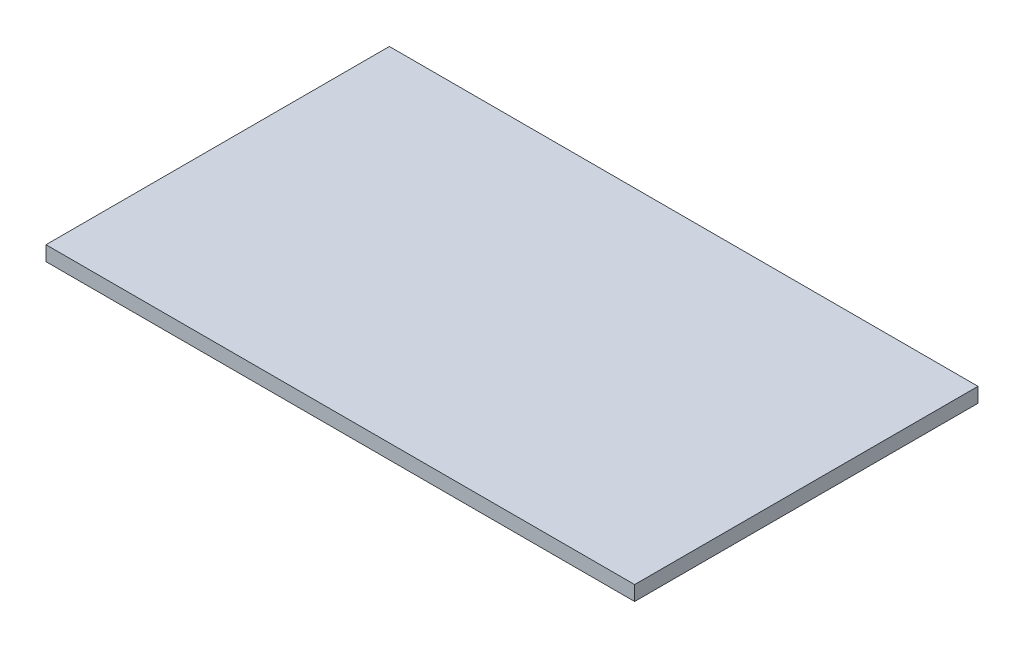
ISO-10303-21;
HEADER;
FILE_DESCRIPTION(('STEP AP214'),'2;1');
FILE_NAME('part.step','',(''),(''),'','','');
FILE_SCHEMA(('AUTOMOTIVE_DESIGN { 1 0 10303 214 1 1 1 1 }'));
ENDSEC;
DATA;
#1=APPLICATION_CONTEXT('core data for automotive mechanical design processes');
#2=APPLICATION_PROTOCOL_DEFINITION('international standard','automotive_design',2000,#1);
#3=PRODUCT_CONTEXT('',#1,'mechanical');
#4=PRODUCT('Part','Part','',(#3));
#5=PRODUCT_RELATED_PRODUCT_CATEGORY('part','',(#4));
#6=PRODUCT_DEFINITION_FORMATION('','',#4);
#7=PRODUCT_DEFINITION_CONTEXT('part definition',#1,'design');
#8=PRODUCT_DEFINITION('design','',#6,#7);
#9=PRODUCT_DEFINITION_SHAPE('','',#8);
#10=(LENGTH_UNIT() NAMED_UNIT(*) SI_UNIT(.MILLI.,.METRE.));
#11=(NAMED_UNIT(*) PLANE_ANGLE_UNIT() SI_UNIT($,.RADIAN.));
#12=(NAMED_UNIT(*) SI_UNIT($,.STERADIAN.) SOLID_ANGLE_UNIT());
#13=UNCERTAINTY_MEASURE_WITH_UNIT(LENGTH_MEASURE(1.E-05),#10,'distance_accuracy_value','');
#14=(GEOMETRIC_REPRESENTATION_CONTEXT(3) GLOBAL_UNCERTAINTY_ASSIGNED_CONTEXT((#13)) GLOBAL_UNIT_ASSIGNED_CONTEXT((#10,
#11,#12)) REPRESENTATION_CONTEXT('',''));
#15=CARTESIAN_POINT('',(0.,0.,0.));
#16=DIRECTION('',(0.,0.,1.));
#17=DIRECTION('',(1.,0.,0.));
#18=AXIS2_PLACEMENT_3D('',#15,#16,#17);
#19=CARTESIAN_POINT('',(0.,3.,0.));
#20=DIRECTION('',(1.,0.,0.));
#21=DIRECTION('',(0.,0.,-1.));
#22=AXIS2_PLACEMENT_3D('',#19,#20,#21);
#23=PLANE('',#22);
#24=DIRECTION('',(0.,0.,1.));
#25=VECTOR('',#24,1.);
#26=CARTESIAN_POINT('',(0.,0.,0.));
#27=LINE('',#26,#25);
#28=CARTESIAN_POINT('',(0.,0.,-70.));
#29=VERTEX_POINT('',#28);
#30=CARTESIAN_POINT('',(0.,0.,0.));
#31=VERTEX_POINT('',#30);
#32=EDGE_CURVE('E107',#29,#31,#27,.T.);
#33=ORIENTED_EDGE('',*,*,#32,.T.);
#34=DIRECTION('',(0.,-1.,0.));
#35=VECTOR('',#34,1.);
#36=CARTESIAN_POINT('',(0.,3.,0.));
#37=LINE('',#36,#35);
#38=CARTESIAN_POINT('',(0.,3.,0.));
#39=VERTEX_POINT('',#38);
#40=EDGE_CURVE('E11',#39,#31,#37,.T.);
#41=ORIENTED_EDGE('',*,*,#40,.F.);
#42=DIRECTION('',(0.,0.,1.));
#43=VECTOR('',#42,1.);
#44=CARTESIAN_POINT('',(0.,3.,0.));
#45=LINE('',#44,#43);
#46=CARTESIAN_POINT('',(0.,3.,-70.));
#47=VERTEX_POINT('',#46);
#48=EDGE_CURVE('E91',#47,#39,#45,.T.);
#49=ORIENTED_EDGE('',*,*,#48,.F.);
#50=DIRECTION('',(0.,-1.,0.));
#51=VECTOR('',#50,1.);
#52=CARTESIAN_POINT('',(0.,3.,-70.));
#53=LINE('',#52,#51);
#54=EDGE_CURVE('E103',#47,#29,#53,.T.);
#55=ORIENTED_EDGE('',*,*,#54,.T.);
#56=EDGE_LOOP('',(#33,#41,#49,#55));
#57=FACE_BOUND('',#56,.T.);
#58=ADVANCED_FACE('F39',(#57),#23,.F.);
#59=CARTESIAN_POINT('',(0.,3.,0.));
#60=DIRECTION('',(0.,0.,-1.));
#61=DIRECTION('',(-1.,0.,0.));
#62=AXIS2_PLACEMENT_3D('',#59,#60,#61);
#63=PLANE('',#62);
#64=DIRECTION('',(1.,0.,0.));
#65=VECTOR('',#64,1.);
#66=CARTESIAN_POINT('',(0.,0.,0.));
#67=LINE('',#66,#65);
#68=CARTESIAN_POINT('',(120.,0.,0.));
#69=VERTEX_POINT('',#68);
#70=EDGE_CURVE('E96',#31,#69,#67,.T.);
#71=ORIENTED_EDGE('',*,*,#70,.T.);
#72=DIRECTION('',(0.,-1.,0.));
#73=VECTOR('',#72,1.);
#74=CARTESIAN_POINT('',(120.,3.,0.));
#75=LINE('',#74,#73);
#76=CARTESIAN_POINT('',(120.,3.,0.));
#77=VERTEX_POINT('',#76);
#78=EDGE_CURVE('E48',#77,#69,#75,.T.);
#79=ORIENTED_EDGE('',*,*,#78,.F.);
#80=DIRECTION('',(1.,0.,0.));
#81=VECTOR('',#80,1.);
#82=CARTESIAN_POINT('',(0.,3.,0.));
#83=LINE('',#82,#81);
#84=EDGE_CURVE('E86',#39,#77,#83,.T.);
#85=ORIENTED_EDGE('',*,*,#84,.F.);
#86=ORIENTED_EDGE('',*,*,#40,.T.);
#87=EDGE_LOOP('',(#71,#79,#85,#86));
#88=FACE_BOUND('',#87,.T.);
#89=ADVANCED_FACE('F95',(#88),#63,.F.);
#90=CARTESIAN_POINT('',(120.,3.,0.));
#91=DIRECTION('',(-1.,0.,0.));
#92=DIRECTION('',(0.,0.,1.));
#93=AXIS2_PLACEMENT_3D('',#90,#91,#92);
#94=PLANE('',#93);
#95=DIRECTION('',(0.,0.,-1.));
#96=VECTOR('',#95,1.);
#97=CARTESIAN_POINT('',(120.,0.,0.));
#98=LINE('',#97,#96);
#99=CARTESIAN_POINT('',(120.,0.,-70.));
#100=VERTEX_POINT('',#99);
#101=EDGE_CURVE('E73',#69,#100,#98,.T.);
#102=ORIENTED_EDGE('',*,*,#101,.T.);
#103=DIRECTION('',(0.,-1.,0.));
#104=VECTOR('',#103,1.);
#105=CARTESIAN_POINT('',(120.,3.,-70.));
#106=LINE('',#105,#104);
#107=CARTESIAN_POINT('',(120.,3.,-70.));
#108=VERTEX_POINT('',#107);
#109=EDGE_CURVE('E98',#108,#100,#106,.T.);
#110=ORIENTED_EDGE('',*,*,#109,.F.);
#111=DIRECTION('',(0.,0.,-1.));
#112=VECTOR('',#111,1.);
#113=CARTESIAN_POINT('',(120.,3.,0.));
#114=LINE('',#113,#112);
#115=EDGE_CURVE('E89',#77,#108,#114,.T.);
#116=ORIENTED_EDGE('',*,*,#115,.F.);
#117=ORIENTED_EDGE('',*,*,#78,.T.);
#118=EDGE_LOOP('',(#102,#110,#116,#117));
#119=FACE_BOUND('',#118,.T.);
#120=ADVANCED_FACE('F99',(#119),#94,.F.);
#121=CARTESIAN_POINT('',(0.,3.,-70.));
#122=DIRECTION('',(0.,0.,1.));
#123=DIRECTION('',(1.,0.,0.));
#124=AXIS2_PLACEMENT_3D('',#121,#122,#123);
#125=PLANE('',#124);
#126=DIRECTION('',(-1.,0.,0.));
#127=VECTOR('',#126,1.);
#128=CARTESIAN_POINT('',(0.,0.,-70.));
#129=LINE('',#128,#127);
#130=EDGE_CURVE('E79',#100,#29,#129,.T.);
#131=ORIENTED_EDGE('',*,*,#130,.T.);
#132=ORIENTED_EDGE('',*,*,#54,.F.);
#133=DIRECTION('',(-1.,0.,0.));
#134=VECTOR('',#133,1.);
#135=CARTESIAN_POINT('',(0.,3.,-70.));
#136=LINE('',#135,#134);
#137=EDGE_CURVE('E56',#108,#47,#136,.T.);
#138=ORIENTED_EDGE('',*,*,#137,.F.);
#139=ORIENTED_EDGE('',*,*,#109,.T.);
#140=EDGE_LOOP('',(#131,#132,#138,#139));
#141=FACE_BOUND('',#140,.T.);
#142=ADVANCED_FACE('F120',(#141),#125,.F.);
#143=CARTESIAN_POINT('',(0.,3.,0.));
#144=DIRECTION('',(0.,-1.,0.));
#145=DIRECTION('',(0.,0.,-1.));
#146=AXIS2_PLACEMENT_3D('',#143,#144,#145);
#147=PLANE('',#146);
#148=ORIENTED_EDGE('',*,*,#48,.T.);
#149=ORIENTED_EDGE('',*,*,#84,.T.);
#150=ORIENTED_EDGE('',*,*,#115,.T.);
#151=ORIENTED_EDGE('',*,*,#137,.T.);
#152=EDGE_LOOP('',(#148,#149,#150,#151));
#153=FACE_BOUND('',#152,.T.);
#154=ADVANCED_FACE('F87',(#153),#147,.F.);
#155=CARTESIAN_POINT('',(0.,0.,0.));
#156=DIRECTION('',(0.,-1.,0.));
#157=DIRECTION('',(0.,0.,-1.));
#158=AXIS2_PLACEMENT_3D('',#155,#156,#157);
#159=PLANE('',#158);
#160=ORIENTED_EDGE('',*,*,#32,.F.);
#161=ORIENTED_EDGE('',*,*,#130,.F.);
#162=ORIENTED_EDGE('',*,*,#101,.F.);
#163=ORIENTED_EDGE('',*,*,#70,.F.);
#164=EDGE_LOOP('',(#160,#161,#162,#163));
#165=FACE_BOUND('',#164,.T.);
#166=ADVANCED_FACE('F123',(#165),#159,.T.);
#167=CLOSED_SHELL('',(#58,#89,#120,#142,#154,#166));
#168=MANIFOLD_SOLID_BREP('B2',#167);
#169=ADVANCED_BREP_SHAPE_REPRESENTATION('',(#18,#168),#14);
#170=SHAPE_DEFINITION_REPRESENTATION(#9,#169);
ENDSEC;
END-ISO-10303-21;
